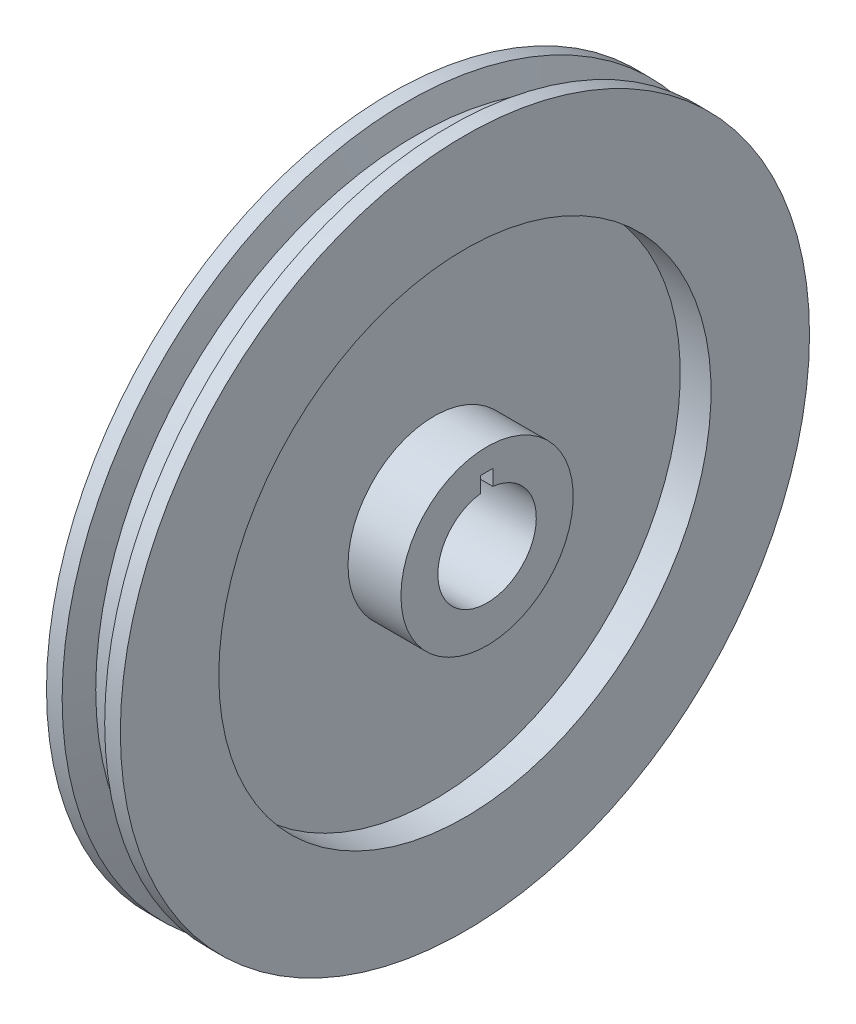
ISO-10303-21;
HEADER;
FILE_DESCRIPTION(('STEP AP214'),'2;1');
FILE_NAME('part.step','',(''),(''),'','','');
FILE_SCHEMA(('AUTOMOTIVE_DESIGN { 1 0 10303 214 1 1 1 1 }'));
ENDSEC;
DATA;
#1=APPLICATION_CONTEXT('core data for automotive mechanical design processes');
#2=APPLICATION_PROTOCOL_DEFINITION('international standard','automotive_design',2000,#1);
#3=PRODUCT_CONTEXT('',#1,'mechanical');
#4=PRODUCT('Part','Part','',(#3));
#5=PRODUCT_RELATED_PRODUCT_CATEGORY('part','',(#4));
#6=PRODUCT_DEFINITION_FORMATION('','',#4);
#7=PRODUCT_DEFINITION_CONTEXT('part definition',#1,'design');
#8=PRODUCT_DEFINITION('design','',#6,#7);
#9=PRODUCT_DEFINITION_SHAPE('','',#8);
#10=(LENGTH_UNIT() NAMED_UNIT(*) SI_UNIT(.MILLI.,.METRE.));
#11=(NAMED_UNIT(*) PLANE_ANGLE_UNIT() SI_UNIT($,.RADIAN.));
#12=(NAMED_UNIT(*) SI_UNIT($,.STERADIAN.) SOLID_ANGLE_UNIT());
#13=UNCERTAINTY_MEASURE_WITH_UNIT(LENGTH_MEASURE(1.E-05),#10,'distance_accuracy_value','');
#14=(GEOMETRIC_REPRESENTATION_CONTEXT(3) GLOBAL_UNCERTAINTY_ASSIGNED_CONTEXT((#13)) GLOBAL_UNIT_ASSIGNED_CONTEXT((#10,
#11,#12)) REPRESENTATION_CONTEXT('',''));
#15=CARTESIAN_POINT('',(0.,0.,0.));
#16=DIRECTION('',(0.,0.,1.));
#17=DIRECTION('',(1.,0.,0.));
#18=AXIS2_PLACEMENT_3D('',#15,#16,#17);
#19=CARTESIAN_POINT('',(0.,0.,477.625663276216));
#20=DIRECTION('',(-1.,0.,0.));
#21=DIRECTION('',(0.,0.,1.));
#22=AXIS2_PLACEMENT_3D('',#19,#20,#21);
#23=CYLINDRICAL_SURFACE('',#22,1778.);
#24=CARTESIAN_POINT('',(-241.3,0.,477.625663276216));
#25=DIRECTION('',(-1.,0.,0.));
#26=DIRECTION('',(0.,0.,1.));
#27=AXIS2_PLACEMENT_3D('',#24,#25,#26);
#28=CIRCLE('',#27,1778.);
#29=CARTESIAN_POINT('',(-241.3,0.,2255.62566327622));
#30=VERTEX_POINT('',#29);
#31=EDGE_CURVE('E103',#30,#30,#28,.T.);
#32=ORIENTED_EDGE('',*,*,#31,.F.);
#33=EDGE_LOOP('',(#32));
#34=FACE_BOUND('',#33,.T.);
#35=CARTESIAN_POINT('',(-160.524219751808,0.,477.625663276216));
#36=DIRECTION('',(-1.,0.,0.));
#37=DIRECTION('',(0.,0.,1.));
#38=AXIS2_PLACEMENT_3D('',#35,#36,#37);
#39=CIRCLE('',#38,1778.);
#40=CARTESIAN_POINT('',(-160.524219751808,0.,2255.62566327622));
#41=VERTEX_POINT('',#40);
#42=EDGE_CURVE('E40',#41,#41,#39,.T.);
#43=ORIENTED_EDGE('',*,*,#42,.T.);
#44=EDGE_LOOP('',(#43));
#45=FACE_BOUND('',#44,.T.);
#46=ADVANCED_FACE('F33',(#34,#45),#23,.T.);
#47=CARTESIAN_POINT('',(-114.300000000001,0.,477.625663276216));
#48=DIRECTION('',(-1.,0.,0.));
#49=DIRECTION('',(0.,0.,1.));
#50=AXIS2_PLACEMENT_3D('',#47,#48,#49);
#51=CONICAL_SURFACE('',#50,1651.,1.22173047639603);
#52=ORIENTED_EDGE('',*,*,#42,.F.);
#53=EDGE_LOOP('',(#52));
#54=FACE_BOUND('',#53,.T.);
#55=CARTESIAN_POINT('',(-114.300000000001,0.,477.625663276216));
#56=DIRECTION('',(-1.,0.,0.));
#57=DIRECTION('',(0.,0.,1.));
#58=AXIS2_PLACEMENT_3D('',#55,#56,#57);
#59=CIRCLE('',#58,1651.);
#60=CARTESIAN_POINT('',(-114.300000000001,0.,2128.62566327622));
#61=VERTEX_POINT('',#60);
#62=EDGE_CURVE('E143',#61,#61,#59,.T.);
#63=ORIENTED_EDGE('',*,*,#62,.T.);
#64=EDGE_LOOP('',(#63));
#65=FACE_BOUND('',#64,.T.);
#66=ADVANCED_FACE('F149',(#54,#65),#51,.T.);
#67=CARTESIAN_POINT('',(0.,0.,477.625663276216));
#68=DIRECTION('',(-1.,0.,0.));
#69=DIRECTION('',(0.,0.,1.));
#70=AXIS2_PLACEMENT_3D('',#67,#68,#69);
#71=CYLINDRICAL_SURFACE('',#70,1651.);
#72=ORIENTED_EDGE('',*,*,#62,.F.);
#73=EDGE_LOOP('',(#72));
#74=FACE_BOUND('',#73,.T.);
#75=CARTESIAN_POINT('',(12.6999999999995,0.,477.625663276216));
#76=DIRECTION('',(-1.,0.,0.));
#77=DIRECTION('',(0.,0.,1.));
#78=AXIS2_PLACEMENT_3D('',#75,#76,#77);
#79=CIRCLE('',#78,1651.);
#80=CARTESIAN_POINT('',(12.6999999999995,0.,2128.62566327622));
#81=VERTEX_POINT('',#80);
#82=EDGE_CURVE('E140',#81,#81,#79,.T.);
#83=ORIENTED_EDGE('',*,*,#82,.T.);
#84=EDGE_LOOP('',(#83));
#85=FACE_BOUND('',#84,.T.);
#86=ADVANCED_FACE('F152',(#74,#85),#71,.T.);
#87=CARTESIAN_POINT('',(58.9242197518068,0.,477.625663276216));
#88=DIRECTION('',(1.,0.,0.));
#89=DIRECTION('',(0.,0.,-1.));
#90=AXIS2_PLACEMENT_3D('',#87,#88,#89);
#91=CONICAL_SURFACE('',#90,1778.,1.22173047639603);
#92=ORIENTED_EDGE('',*,*,#82,.F.);
#93=EDGE_LOOP('',(#92));
#94=FACE_BOUND('',#93,.T.);
#95=CARTESIAN_POINT('',(58.9242197518068,0.,477.625663276216));
#96=DIRECTION('',(-1.,0.,0.));
#97=DIRECTION('',(0.,0.,1.));
#98=AXIS2_PLACEMENT_3D('',#95,#96,#97);
#99=CIRCLE('',#98,1778.);
#100=CARTESIAN_POINT('',(58.9242197518068,0.,2255.62566327622));
#101=VERTEX_POINT('',#100);
#102=EDGE_CURVE('E137',#101,#101,#99,.T.);
#103=ORIENTED_EDGE('',*,*,#102,.T.);
#104=EDGE_LOOP('',(#103));
#105=FACE_BOUND('',#104,.T.);
#106=ADVANCED_FACE('F157',(#94,#105),#91,.T.);
#107=CARTESIAN_POINT('',(0.,0.,477.625663276216));
#108=DIRECTION('',(-1.,0.,0.));
#109=DIRECTION('',(0.,0.,1.));
#110=AXIS2_PLACEMENT_3D('',#107,#108,#109);
#111=CYLINDRICAL_SURFACE('',#110,1778.);
#112=ORIENTED_EDGE('',*,*,#102,.F.);
#113=EDGE_LOOP('',(#112));
#114=FACE_BOUND('',#113,.T.);
#115=CARTESIAN_POINT('',(139.7,0.,477.625663276216));
#116=DIRECTION('',(-1.,0.,0.));
#117=DIRECTION('',(0.,0.,1.));
#118=AXIS2_PLACEMENT_3D('',#115,#116,#117);
#119=CIRCLE('',#118,1778.);
#120=CARTESIAN_POINT('',(139.7,0.,2255.62566327622));
#121=VERTEX_POINT('',#120);
#122=EDGE_CURVE('E134',#121,#121,#119,.T.);
#123=ORIENTED_EDGE('',*,*,#122,.T.);
#124=EDGE_LOOP('',(#123));
#125=FACE_BOUND('',#124,.T.);
#126=ADVANCED_FACE('F163',(#114,#125),#111,.T.);
#127=CARTESIAN_POINT('',(139.7,0.,-1300.37433672378));
#128=DIRECTION('',(-1.,0.,0.));
#129=DIRECTION('',(0.,0.,1.));
#130=AXIS2_PLACEMENT_3D('',#127,#128,#129);
#131=PLANE('',#130);
#132=ORIENTED_EDGE('',*,*,#122,.F.);
#133=EDGE_LOOP('',(#132));
#134=FACE_BOUND('',#133,.T.);
#135=CARTESIAN_POINT('',(139.7,0.,477.625663276216));
#136=DIRECTION('',(-1.,0.,0.));
#137=DIRECTION('',(0.,0.,1.));
#138=AXIS2_PLACEMENT_3D('',#135,#136,#137);
#139=CIRCLE('',#138,1270.);
#140=CARTESIAN_POINT('',(139.7,0.,1747.62566327622));
#141=VERTEX_POINT('',#140);
#142=EDGE_CURVE('E131',#141,#141,#139,.T.);
#143=ORIENTED_EDGE('',*,*,#142,.T.);
#144=EDGE_LOOP('',(#143));
#145=FACE_BOUND('',#144,.T.);
#146=ADVANCED_FACE('F169',(#134,#145),#131,.F.);
#147=CARTESIAN_POINT('',(0.,0.,477.625663276216));
#148=DIRECTION('',(-1.,0.,0.));
#149=DIRECTION('',(0.,0.,1.));
#150=AXIS2_PLACEMENT_3D('',#147,#148,#149);
#151=CYLINDRICAL_SURFACE('',#150,1270.);
#152=ORIENTED_EDGE('',*,*,#142,.F.);
#153=EDGE_LOOP('',(#152));
#154=FACE_BOUND('',#153,.T.);
#155=CARTESIAN_POINT('',(-19.0500000000005,0.,477.625663276216));
#156=DIRECTION('',(-1.,0.,0.));
#157=DIRECTION('',(0.,0.,1.));
#158=AXIS2_PLACEMENT_3D('',#155,#156,#157);
#159=CIRCLE('',#158,1270.);
#160=CARTESIAN_POINT('',(-19.0500000000005,0.,1747.62566327622));
#161=VERTEX_POINT('',#160);
#162=EDGE_CURVE('E128',#161,#161,#159,.T.);
#163=ORIENTED_EDGE('',*,*,#162,.T.);
#164=EDGE_LOOP('',(#163));
#165=FACE_BOUND('',#164,.T.);
#166=ADVANCED_FACE('F175',(#154,#165),#151,.F.);
#167=CARTESIAN_POINT('',(-19.0500000000005,0.,-792.374336723784));
#168=DIRECTION('',(-1.,0.,0.));
#169=DIRECTION('',(0.,0.,1.));
#170=AXIS2_PLACEMENT_3D('',#167,#168,#169);
#171=PLANE('',#170);
#172=ORIENTED_EDGE('',*,*,#162,.F.);
#173=EDGE_LOOP('',(#172));
#174=FACE_BOUND('',#173,.T.);
#175=CARTESIAN_POINT('',(-19.0500000000005,0.,477.625663276216));
#176=DIRECTION('',(-1.,0.,0.));
#177=DIRECTION('',(0.,0.,1.));
#178=AXIS2_PLACEMENT_3D('',#175,#176,#177);
#179=CIRCLE('',#178,444.5);
#180=CARTESIAN_POINT('',(-19.0500000000005,0.,922.125663276216));
#181=VERTEX_POINT('',#180);
#182=EDGE_CURVE('E125',#181,#181,#179,.T.);
#183=ORIENTED_EDGE('',*,*,#182,.T.);
#184=EDGE_LOOP('',(#183));
#185=FACE_BOUND('',#184,.T.);
#186=ADVANCED_FACE('F181',(#174,#185),#171,.F.);
#187=CARTESIAN_POINT('',(0.,0.,477.625663276216));
#188=DIRECTION('',(-1.,0.,0.));
#189=DIRECTION('',(0.,0.,1.));
#190=AXIS2_PLACEMENT_3D('',#187,#188,#189);
#191=CYLINDRICAL_SURFACE('',#190,444.5);
#192=ORIENTED_EDGE('',*,*,#182,.F.);
#193=EDGE_LOOP('',(#192));
#194=FACE_BOUND('',#193,.T.);
#195=CARTESIAN_POINT('',(254.,0.,477.625663276216));
#196=DIRECTION('',(-1.,0.,0.));
#197=DIRECTION('',(0.,0.,1.));
#198=AXIS2_PLACEMENT_3D('',#195,#196,#197);
#199=CIRCLE('',#198,444.5);
#200=CARTESIAN_POINT('',(254.,0.,922.125663276216));
#201=VERTEX_POINT('',#200);
#202=EDGE_CURVE('E122',#201,#201,#199,.T.);
#203=ORIENTED_EDGE('',*,*,#202,.T.);
#204=EDGE_LOOP('',(#203));
#205=FACE_BOUND('',#204,.T.);
#206=ADVANCED_FACE('F187',(#194,#205),#191,.T.);
#207=CARTESIAN_POINT('',(254.,0.,33.1256632762159));
#208=DIRECTION('',(-1.,0.,0.));
#209=DIRECTION('',(0.,0.,1.));
#210=AXIS2_PLACEMENT_3D('',#207,#208,#209);
#211=PLANE('',#210);
#212=CARTESIAN_POINT('',(254.,0.,477.625663276216));
#213=DIRECTION('',(-1.,0.,0.));
#214=DIRECTION('',(0.,0.,1.));
#215=AXIS2_PLACEMENT_3D('',#212,#213,#214);
#216=CIRCLE('',#215,254.);
#217=CARTESIAN_POINT('',(254.,252.303521780452,448.318106278389));
#218=VERTEX_POINT('',#217);
#219=CARTESIAN_POINT('',(254.,251.688054626244,511.818106278389));
#220=VERTEX_POINT('',#219);
#221=EDGE_CURVE('E119',#218,#220,#216,.T.);
#222=ORIENTED_EDGE('',*,*,#221,.T.);
#223=DIRECTION('',(0.,1.,0.));
#224=VECTOR('',#223,1.);
#225=CARTESIAN_POINT('',(254.,0.,511.818106278389));
#226=LINE('',#225,#224);
#227=CARTESIAN_POINT('',(254.,332.19847873574,511.818106278389));
#228=VERTEX_POINT('',#227);
#229=EDGE_CURVE('E54',#220,#228,#226,.T.);
#230=ORIENTED_EDGE('',*,*,#229,.T.);
#231=DIRECTION('',(0.,0.,-1.));
#232=VECTOR('',#231,1.);
#233=CARTESIAN_POINT('',(254.,332.19847873574,33.1256632762159));
#234=LINE('',#233,#232);
#235=CARTESIAN_POINT('',(254.,332.19847873574,448.318106278389));
#236=VERTEX_POINT('',#235);
#237=EDGE_CURVE('E81',#228,#236,#234,.T.);
#238=ORIENTED_EDGE('',*,*,#237,.T.);
#239=DIRECTION('',(0.,-1.,0.));
#240=VECTOR('',#239,1.);
#241=CARTESIAN_POINT('',(254.,0.,448.318106278389));
#242=LINE('',#241,#240);
#243=EDGE_CURVE('E79',#236,#218,#242,.T.);
#244=ORIENTED_EDGE('',*,*,#243,.T.);
#245=EDGE_LOOP('',(#222,#230,#238,#244));
#246=FACE_BOUND('',#245,.T.);
#247=ORIENTED_EDGE('',*,*,#202,.F.);
#248=EDGE_LOOP('',(#247));
#249=FACE_BOUND('',#248,.T.);
#250=ADVANCED_FACE('F193',(#246,#249),#211,.F.);
#251=CARTESIAN_POINT('',(0.,0.,477.625663276216));
#252=DIRECTION('',(-1.,0.,0.));
#253=DIRECTION('',(0.,0.,1.));
#254=AXIS2_PLACEMENT_3D('',#251,#252,#253);
#255=CYLINDRICAL_SURFACE('',#254,254.);
#256=CARTESIAN_POINT('',(-254.,0.,477.625663276216));
#257=DIRECTION('',(-1.,0.,0.));
#258=DIRECTION('',(0.,0.,1.));
#259=AXIS2_PLACEMENT_3D('',#256,#257,#258);
#260=CIRCLE('',#259,254.);
#261=CARTESIAN_POINT('',(-254.,252.303521780452,448.318106278389));
#262=VERTEX_POINT('',#261);
#263=CARTESIAN_POINT('',(-254.,251.688054626244,511.818106278389));
#264=VERTEX_POINT('',#263);
#265=EDGE_CURVE('E92',#262,#264,#260,.T.);
#266=ORIENTED_EDGE('',*,*,#265,.T.);
#267=DIRECTION('',(-1.,0.,0.));
#268=VECTOR('',#267,1.);
#269=CARTESIAN_POINT('',(0.,251.688054626244,511.818106278389));
#270=LINE('',#269,#268);
#271=EDGE_CURVE('E100',#264,#220,#270,.F.);
#272=ORIENTED_EDGE('',*,*,#271,.T.);
#273=ORIENTED_EDGE('',*,*,#221,.F.);
#274=DIRECTION('',(-1.,0.,0.));
#275=VECTOR('',#274,1.);
#276=CARTESIAN_POINT('',(0.,252.303521780452,448.318106278389));
#277=LINE('',#276,#275);
#278=EDGE_CURVE('E97',#218,#262,#277,.T.);
#279=ORIENTED_EDGE('',*,*,#278,.T.);
#280=EDGE_LOOP('',(#266,#272,#273,#279));
#281=FACE_BOUND('',#280,.T.);
#282=ADVANCED_FACE('F198',(#281),#255,.F.);
#283=CARTESIAN_POINT('',(-254.,0.,33.1256632762159));
#284=DIRECTION('',(1.,0.,0.));
#285=DIRECTION('',(0.,0.,-1.));
#286=AXIS2_PLACEMENT_3D('',#283,#284,#285);
#287=PLANE('',#286);
#288=DIRECTION('',(0.,0.,-1.));
#289=VECTOR('',#288,1.);
#290=CARTESIAN_POINT('',(-254.,332.19847873574,448.318106278389));
#291=LINE('',#290,#289);
#292=CARTESIAN_POINT('',(-254.,332.19847873574,511.81810627839));
#293=VERTEX_POINT('',#292);
#294=CARTESIAN_POINT('',(-254.,332.19847873574,448.318106278389));
#295=VERTEX_POINT('',#294);
#296=EDGE_CURVE('E84',#293,#295,#291,.T.);
#297=ORIENTED_EDGE('',*,*,#296,.F.);
#298=DIRECTION('',(0.,-1.,0.));
#299=VECTOR('',#298,1.);
#300=CARTESIAN_POINT('',(-254.,0.,511.818106278389));
#301=LINE('',#300,#299);
#302=EDGE_CURVE('E11',#293,#264,#301,.T.);
#303=ORIENTED_EDGE('',*,*,#302,.T.);
#304=ORIENTED_EDGE('',*,*,#265,.F.);
#305=DIRECTION('',(0.,-1.,0.));
#306=VECTOR('',#305,1.);
#307=CARTESIAN_POINT('',(-254.,332.19847873574,448.318106278389));
#308=LINE('',#307,#306);
#309=EDGE_CURVE('E76',#295,#262,#308,.T.);
#310=ORIENTED_EDGE('',*,*,#309,.F.);
#311=EDGE_LOOP('',(#297,#303,#304,#310));
#312=FACE_BOUND('',#311,.T.);
#313=CARTESIAN_POINT('',(-254.,0.,477.625663276216));
#314=DIRECTION('',(-1.,0.,0.));
#315=DIRECTION('',(0.,0.,1.));
#316=AXIS2_PLACEMENT_3D('',#313,#314,#315);
#317=CIRCLE('',#316,444.5);
#318=CARTESIAN_POINT('',(-254.,0.,922.125663276216));
#319=VERTEX_POINT('',#318);
#320=EDGE_CURVE('E115',#319,#319,#317,.T.);
#321=ORIENTED_EDGE('',*,*,#320,.T.);
#322=EDGE_LOOP('',(#321));
#323=FACE_BOUND('',#322,.T.);
#324=ADVANCED_FACE('F89',(#312,#323),#287,.F.);
#325=CARTESIAN_POINT('',(0.,0.,477.625663276216));
#326=DIRECTION('',(-1.,0.,0.));
#327=DIRECTION('',(0.,0.,1.));
#328=AXIS2_PLACEMENT_3D('',#325,#326,#327);
#329=CYLINDRICAL_SURFACE('',#328,444.5);
#330=ORIENTED_EDGE('',*,*,#320,.F.);
#331=EDGE_LOOP('',(#330));
#332=FACE_BOUND('',#331,.T.);
#333=CARTESIAN_POINT('',(-82.5500000000005,0.,477.625663276216));
#334=DIRECTION('',(-1.,0.,0.));
#335=DIRECTION('',(0.,0.,1.));
#336=AXIS2_PLACEMENT_3D('',#333,#334,#335);
#337=CIRCLE('',#336,444.5);
#338=CARTESIAN_POINT('',(-82.5500000000005,0.,922.125663276216));
#339=VERTEX_POINT('',#338);
#340=EDGE_CURVE('E112',#339,#339,#337,.T.);
#341=ORIENTED_EDGE('',*,*,#340,.T.);
#342=EDGE_LOOP('',(#341));
#343=FACE_BOUND('',#342,.T.);
#344=ADVANCED_FACE('F231',(#332,#343),#329,.T.);
#345=CARTESIAN_POINT('',(-82.5500000000005,0.,-792.374336723784));
#346=DIRECTION('',(1.,0.,0.));
#347=DIRECTION('',(0.,0.,-1.));
#348=AXIS2_PLACEMENT_3D('',#345,#346,#347);
#349=PLANE('',#348);
#350=ORIENTED_EDGE('',*,*,#340,.F.);
#351=EDGE_LOOP('',(#350));
#352=FACE_BOUND('',#351,.T.);
#353=CARTESIAN_POINT('',(-82.5500000000005,0.,477.625663276216));
#354=DIRECTION('',(-1.,0.,0.));
#355=DIRECTION('',(0.,0.,1.));
#356=AXIS2_PLACEMENT_3D('',#353,#354,#355);
#357=CIRCLE('',#356,1270.);
#358=CARTESIAN_POINT('',(-82.5500000000005,0.,1747.62566327622));
#359=VERTEX_POINT('',#358);
#360=EDGE_CURVE('E109',#359,#359,#357,.T.);
#361=ORIENTED_EDGE('',*,*,#360,.T.);
#362=EDGE_LOOP('',(#361));
#363=FACE_BOUND('',#362,.T.);
#364=ADVANCED_FACE('F223',(#352,#363),#349,.F.);
#365=CARTESIAN_POINT('',(0.,0.,477.625663276216));
#366=DIRECTION('',(-1.,0.,0.));
#367=DIRECTION('',(0.,0.,1.));
#368=AXIS2_PLACEMENT_3D('',#365,#366,#367);
#369=CYLINDRICAL_SURFACE('',#368,1270.);
#370=ORIENTED_EDGE('',*,*,#360,.F.);
#371=EDGE_LOOP('',(#370));
#372=FACE_BOUND('',#371,.T.);
#373=CARTESIAN_POINT('',(-241.3,0.,477.625663276216));
#374=DIRECTION('',(-1.,0.,0.));
#375=DIRECTION('',(0.,0.,1.));
#376=AXIS2_PLACEMENT_3D('',#373,#374,#375);
#377=CIRCLE('',#376,1270.);
#378=CARTESIAN_POINT('',(-241.3,0.,1747.62566327622));
#379=VERTEX_POINT('',#378);
#380=EDGE_CURVE('E106',#379,#379,#377,.T.);
#381=ORIENTED_EDGE('',*,*,#380,.T.);
#382=EDGE_LOOP('',(#381));
#383=FACE_BOUND('',#382,.T.);
#384=ADVANCED_FACE('F215',(#372,#383),#369,.F.);
#385=CARTESIAN_POINT('',(-241.3,0.,-1300.37433672378));
#386=DIRECTION('',(1.,0.,0.));
#387=DIRECTION('',(0.,0.,-1.));
#388=AXIS2_PLACEMENT_3D('',#385,#386,#387);
#389=PLANE('',#388);
#390=ORIENTED_EDGE('',*,*,#380,.F.);
#391=EDGE_LOOP('',(#390));
#392=FACE_BOUND('',#391,.T.);
#393=ORIENTED_EDGE('',*,*,#31,.T.);
#394=EDGE_LOOP('',(#393));
#395=FACE_BOUND('',#394,.T.);
#396=ADVANCED_FACE('F212',(#392,#395),#389,.F.);
#397=CARTESIAN_POINT('',(1016.,332.19847873574,511.818106278389));
#398=DIRECTION('',(0.,0.,1.));
#399=DIRECTION('',(1.,0.,0.));
#400=AXIS2_PLACEMENT_3D('',#397,#398,#399);
#401=PLANE('',#400);
#402=ORIENTED_EDGE('',*,*,#271,.F.);
#403=ORIENTED_EDGE('',*,*,#302,.F.);
#404=DIRECTION('',(-1.,0.,0.));
#405=VECTOR('',#404,1.);
#406=CARTESIAN_POINT('',(1016.,332.19847873574,511.818106278389));
#407=LINE('',#406,#405);
#408=EDGE_CURVE('E47',#228,#293,#407,.T.);
#409=ORIENTED_EDGE('',*,*,#408,.F.);
#410=ORIENTED_EDGE('',*,*,#229,.F.);
#411=EDGE_LOOP('',(#402,#403,#409,#410));
#412=FACE_BOUND('',#411,.T.);
#413=ADVANCED_FACE('F214',(#412),#401,.F.);
#414=CARTESIAN_POINT('',(1016.,332.19847873574,448.318106278389));
#415=DIRECTION('',(0.,0.,-1.));
#416=DIRECTION('',(-1.,0.,0.));
#417=AXIS2_PLACEMENT_3D('',#414,#415,#416);
#418=PLANE('',#417);
#419=DIRECTION('',(-1.,0.,0.));
#420=VECTOR('',#419,1.);
#421=CARTESIAN_POINT('',(1016.,332.19847873574,448.318106278389));
#422=LINE('',#421,#420);
#423=EDGE_CURVE('E73',#236,#295,#422,.T.);
#424=ORIENTED_EDGE('',*,*,#423,.T.);
#425=ORIENTED_EDGE('',*,*,#309,.T.);
#426=ORIENTED_EDGE('',*,*,#278,.F.);
#427=ORIENTED_EDGE('',*,*,#243,.F.);
#428=EDGE_LOOP('',(#424,#425,#426,#427));
#429=FACE_BOUND('',#428,.T.);
#430=ADVANCED_FACE('F74',(#429),#418,.F.);
#431=CARTESIAN_POINT('',(1016.,332.19847873574,448.318106278389));
#432=DIRECTION('',(0.,1.,0.));
#433=DIRECTION('',(0.,0.,1.));
#434=AXIS2_PLACEMENT_3D('',#431,#432,#433);
#435=PLANE('',#434);
#436=ORIENTED_EDGE('',*,*,#408,.T.);
#437=ORIENTED_EDGE('',*,*,#296,.T.);
#438=ORIENTED_EDGE('',*,*,#423,.F.);
#439=ORIENTED_EDGE('',*,*,#237,.F.);
#440=EDGE_LOOP('',(#436,#437,#438,#439));
#441=FACE_BOUND('',#440,.T.);
#442=ADVANCED_FACE('F85',(#441),#435,.F.);
#443=CLOSED_SHELL('',(#46,#66,#86,#106,#126,#146,#166,#186,#206,#250,#282,#324,#344,#364,#384,
#396,#413,#430,#442));
#444=MANIFOLD_SOLID_BREP('B2',#443);
#445=ADVANCED_BREP_SHAPE_REPRESENTATION('',(#18,#444),#14);
#446=SHAPE_DEFINITION_REPRESENTATION(#9,#445);
ENDSEC;
END-ISO-10303-21;
